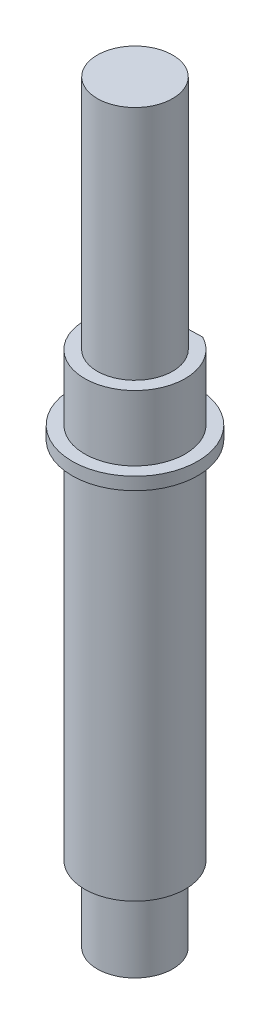
ISO-10303-21;
HEADER;
FILE_DESCRIPTION(('STEP AP214'),'2;1');
FILE_NAME('part.step','',(''),(''),'','','');
FILE_SCHEMA(('AUTOMOTIVE_DESIGN { 1 0 10303 214 1 1 1 1 }'));
ENDSEC;
DATA;
#1=APPLICATION_CONTEXT('core data for automotive mechanical design processes');
#2=APPLICATION_PROTOCOL_DEFINITION('international standard','automotive_design',2000,#1);
#3=PRODUCT_CONTEXT('',#1,'mechanical');
#4=PRODUCT('Part','Part','',(#3));
#5=PRODUCT_RELATED_PRODUCT_CATEGORY('part','',(#4));
#6=PRODUCT_DEFINITION_FORMATION('','',#4);
#7=PRODUCT_DEFINITION_CONTEXT('part definition',#1,'design');
#8=PRODUCT_DEFINITION('design','',#6,#7);
#9=PRODUCT_DEFINITION_SHAPE('','',#8);
#10=(LENGTH_UNIT() NAMED_UNIT(*) SI_UNIT(.MILLI.,.METRE.));
#11=(NAMED_UNIT(*) PLANE_ANGLE_UNIT() SI_UNIT($,.RADIAN.));
#12=(NAMED_UNIT(*) SI_UNIT($,.STERADIAN.) SOLID_ANGLE_UNIT());
#13=UNCERTAINTY_MEASURE_WITH_UNIT(LENGTH_MEASURE(1.E-05),#10,'distance_accuracy_value','');
#14=(GEOMETRIC_REPRESENTATION_CONTEXT(3) GLOBAL_UNCERTAINTY_ASSIGNED_CONTEXT((#13)) GLOBAL_UNIT_ASSIGNED_CONTEXT((#10,
#11,#12)) REPRESENTATION_CONTEXT('',''));
#15=CARTESIAN_POINT('',(0.,0.,0.));
#16=DIRECTION('',(0.,0.,1.));
#17=DIRECTION('',(1.,0.,0.));
#18=AXIS2_PLACEMENT_3D('',#15,#16,#17);
#19=CARTESIAN_POINT('',(0.,3.,0.));
#20=DIRECTION('',(0.,1.,0.));
#21=DIRECTION('',(0.,0.,1.));
#22=AXIS2_PLACEMENT_3D('',#19,#20,#21);
#23=CYLINDRICAL_SURFACE('',#22,2.);
#24=CARTESIAN_POINT('',(0.,3.,0.));
#25=DIRECTION('',(0.,-1.,0.));
#26=DIRECTION('',(0.,0.,-1.));
#27=AXIS2_PLACEMENT_3D('',#24,#25,#26);
#28=CIRCLE('',#27,2.);
#29=CARTESIAN_POINT('',(0.,3.,-2.));
#30=VERTEX_POINT('',#29);
#31=EDGE_CURVE('E90',#30,#30,#28,.T.);
#32=ORIENTED_EDGE('',*,*,#31,.F.);
#33=EDGE_LOOP('',(#32));
#34=FACE_BOUND('',#33,.T.);
#35=CARTESIAN_POINT('',(0.,17.5,0.));
#36=DIRECTION('',(0.,1.,0.));
#37=DIRECTION('',(0.,0.,1.));
#38=AXIS2_PLACEMENT_3D('',#35,#36,#37);
#39=CIRCLE('',#38,2.);
#40=CARTESIAN_POINT('',(0.,17.5,2.));
#41=VERTEX_POINT('',#40);
#42=EDGE_CURVE('E11',#41,#41,#39,.T.);
#43=ORIENTED_EDGE('',*,*,#42,.F.);
#44=EDGE_LOOP('',(#43));
#45=FACE_BOUND('',#44,.T.);
#46=ADVANCED_FACE('F35',(#34,#45),#23,.T.);
#47=CARTESIAN_POINT('',(0.,30.,0.));
#48=DIRECTION('',(0.,-1.,0.));
#49=DIRECTION('',(0.,0.,-1.));
#50=AXIS2_PLACEMENT_3D('',#47,#48,#49);
#51=CYLINDRICAL_SURFACE('',#50,1.5);
#52=CARTESIAN_POINT('',(0.,3.,0.));
#53=DIRECTION('',(0.,-1.,0.));
#54=DIRECTION('',(0.,0.,-1.));
#55=AXIS2_PLACEMENT_3D('',#52,#53,#54);
#56=CIRCLE('',#55,1.5);
#57=CARTESIAN_POINT('',(0.,3.,-1.5));
#58=VERTEX_POINT('',#57);
#59=EDGE_CURVE('E74',#58,#58,#56,.T.);
#60=ORIENTED_EDGE('',*,*,#59,.T.);
#61=EDGE_LOOP('',(#60));
#62=FACE_BOUND('',#61,.T.);
#63=CARTESIAN_POINT('',(0.,0.,0.));
#64=DIRECTION('',(0.,1.,0.));
#65=DIRECTION('',(0.,0.,1.));
#66=AXIS2_PLACEMENT_3D('',#63,#64,#65);
#67=CIRCLE('',#66,1.5);
#68=CARTESIAN_POINT('',(0.,0.,1.5));
#69=VERTEX_POINT('',#68);
#70=EDGE_CURVE('E93',#69,#69,#67,.T.);
#71=ORIENTED_EDGE('',*,*,#70,.T.);
#72=EDGE_LOOP('',(#71));
#73=FACE_BOUND('',#72,.T.);
#74=ADVANCED_FACE('F37',(#62,#73),#51,.T.);
#75=CARTESIAN_POINT('',(0.,0.,0.));
#76=DIRECTION('',(0.,1.,0.));
#77=DIRECTION('',(0.,0.,1.));
#78=AXIS2_PLACEMENT_3D('',#75,#76,#77);
#79=PLANE('',#78);
#80=ORIENTED_EDGE('',*,*,#70,.F.);
#81=EDGE_LOOP('',(#80));
#82=FACE_BOUND('',#81,.T.);
#83=ADVANCED_FACE('F99',(#82),#79,.F.);
#84=CARTESIAN_POINT('',(0.,3.,0.));
#85=DIRECTION('',(0.,-1.,0.));
#86=DIRECTION('',(0.,0.,-1.));
#87=AXIS2_PLACEMENT_3D('',#84,#85,#86);
#88=PLANE('',#87);
#89=ORIENTED_EDGE('',*,*,#31,.T.);
#90=EDGE_LOOP('',(#89));
#91=FACE_BOUND('',#90,.T.);
#92=ORIENTED_EDGE('',*,*,#59,.F.);
#93=EDGE_LOOP('',(#92));
#94=FACE_BOUND('',#93,.T.);
#95=ADVANCED_FACE('F101',(#91,#94),#88,.T.);
#96=CARTESIAN_POINT('',(0.,17.5,0.));
#97=DIRECTION('',(0.,1.,0.));
#98=DIRECTION('',(0.,0.,1.));
#99=AXIS2_PLACEMENT_3D('',#96,#97,#98);
#100=CYLINDRICAL_SURFACE('',#99,2.5);
#101=CARTESIAN_POINT('',(0.,17.5,0.));
#102=DIRECTION('',(0.,1.,0.));
#103=DIRECTION('',(0.,0.,1.));
#104=AXIS2_PLACEMENT_3D('',#101,#102,#103);
#105=CIRCLE('',#104,2.5);
#106=CARTESIAN_POINT('',(0.,17.5,2.5));
#107=VERTEX_POINT('',#106);
#108=EDGE_CURVE('E83',#107,#107,#105,.T.);
#109=ORIENTED_EDGE('',*,*,#108,.T.);
#110=EDGE_LOOP('',(#109));
#111=FACE_BOUND('',#110,.T.);
#112=CARTESIAN_POINT('',(0.,18.,0.));
#113=DIRECTION('',(0.,1.,0.));
#114=DIRECTION('',(0.,0.,1.));
#115=AXIS2_PLACEMENT_3D('',#112,#113,#114);
#116=CIRCLE('',#115,2.5);
#117=CARTESIAN_POINT('',(0.,18.,2.5));
#118=VERTEX_POINT('',#117);
#119=EDGE_CURVE('E69',#118,#118,#116,.T.);
#120=ORIENTED_EDGE('',*,*,#119,.F.);
#121=EDGE_LOOP('',(#120));
#122=FACE_BOUND('',#121,.T.);
#123=ADVANCED_FACE('F106',(#111,#122),#100,.T.);
#124=CARTESIAN_POINT('',(0.,17.5,0.));
#125=DIRECTION('',(0.,1.,0.));
#126=DIRECTION('',(0.,0.,1.));
#127=AXIS2_PLACEMENT_3D('',#124,#125,#126);
#128=PLANE('',#127);
#129=ORIENTED_EDGE('',*,*,#42,.T.);
#130=EDGE_LOOP('',(#129));
#131=FACE_BOUND('',#130,.T.);
#132=ORIENTED_EDGE('',*,*,#108,.F.);
#133=EDGE_LOOP('',(#132));
#134=FACE_BOUND('',#133,.T.);
#135=ADVANCED_FACE('F134',(#131,#134),#128,.F.);
#136=CARTESIAN_POINT('',(0.,30.,0.));
#137=DIRECTION('',(0.,1.,0.));
#138=DIRECTION('',(0.,0.,1.));
#139=AXIS2_PLACEMENT_3D('',#136,#137,#138);
#140=PLANE('',#139);
#141=CARTESIAN_POINT('',(0.,30.,0.));
#142=DIRECTION('',(0.,1.,0.));
#143=DIRECTION('',(0.,0.,1.));
#144=AXIS2_PLACEMENT_3D('',#141,#142,#143);
#145=CIRCLE('',#144,1.5);
#146=CARTESIAN_POINT('',(0.,30.,1.5));
#147=VERTEX_POINT('',#146);
#148=EDGE_CURVE('E44',#147,#147,#145,.T.);
#149=ORIENTED_EDGE('',*,*,#148,.T.);
#150=EDGE_LOOP('',(#149));
#151=FACE_BOUND('',#150,.T.);
#152=ADVANCED_FACE('F137',(#151),#140,.T.);
#153=CARTESIAN_POINT('',(0.,20.6,0.));
#154=DIRECTION('',(0.,1.,0.));
#155=DIRECTION('',(0.,0.,1.));
#156=AXIS2_PLACEMENT_3D('',#153,#154,#155);
#157=CIRCLE('',#156,1.5);
#158=CARTESIAN_POINT('',(0.,20.6,1.5));
#159=VERTEX_POINT('',#158);
#160=EDGE_CURVE('E79',#159,#159,#157,.T.);
#161=ORIENTED_EDGE('',*,*,#160,.T.);
#162=EDGE_LOOP('',(#161));
#163=FACE_BOUND('',#162,.T.);
#164=ORIENTED_EDGE('',*,*,#148,.F.);
#165=EDGE_LOOP('',(#164));
#166=FACE_BOUND('',#165,.T.);
#167=ADVANCED_FACE('F110',(#163,#166),#51,.T.);
#168=CARTESIAN_POINT('',(0.,20.6,0.));
#169=DIRECTION('',(0.,1.,0.));
#170=DIRECTION('',(0.,0.,1.));
#171=AXIS2_PLACEMENT_3D('',#168,#169,#170);
#172=PLANE('',#171);
#173=CARTESIAN_POINT('',(0.,20.6,0.));
#174=DIRECTION('',(0.,1.,0.));
#175=DIRECTION('',(0.,0.,1.));
#176=AXIS2_PLACEMENT_3D('',#173,#174,#175);
#177=CIRCLE('',#176,2.);
#178=CARTESIAN_POINT('',(-1.02224970081514,20.6,-1.71901295782881));
#179=VERTEX_POINT('',#178);
#180=CARTESIAN_POINT('',(0.916253010313562,20.6,-1.77777400731683));
#181=VERTEX_POINT('',#180);
#182=EDGE_CURVE('E78',#179,#181,#177,.T.);
#183=ORIENTED_EDGE('',*,*,#182,.T.);
#184=DIRECTION('',(-0.99954088962964,0.,0.0302986791525441));
#185=VECTOR('',#184,1.);
#186=CARTESIAN_POINT('',(0.916253010313562,20.6,-1.77777400731683));
#187=LINE('',#186,#185);
#188=EDGE_CURVE('E50',#181,#179,#187,.T.);
#189=ORIENTED_EDGE('',*,*,#188,.T.);
#190=EDGE_LOOP('',(#183,#189));
#191=FACE_BOUND('',#190,.T.);
#192=ORIENTED_EDGE('',*,*,#160,.F.);
#193=EDGE_LOOP('',(#192));
#194=FACE_BOUND('',#193,.T.);
#195=ADVANCED_FACE('F128',(#191,#194),#172,.T.);
#196=CARTESIAN_POINT('',(0.,18.,0.));
#197=DIRECTION('',(0.,-1.,0.));
#198=DIRECTION('',(0.,0.,-1.));
#199=AXIS2_PLACEMENT_3D('',#196,#197,#198);
#200=PLANE('',#199);
#201=DIRECTION('',(-0.99954088962964,0.,0.0302986791525441));
#202=VECTOR('',#201,1.);
#203=CARTESIAN_POINT('',(0.916253010313562,18.,-1.77777400731683));
#204=LINE('',#203,#202);
#205=CARTESIAN_POINT('',(0.916253010313562,18.,-1.77777400731683));
#206=VERTEX_POINT('',#205);
#207=CARTESIAN_POINT('',(-1.02224970081514,18.,-1.71901295782881));
#208=VERTEX_POINT('',#207);
#209=EDGE_CURVE('E73',#206,#208,#204,.T.);
#210=ORIENTED_EDGE('',*,*,#209,.F.);
#211=CARTESIAN_POINT('',(0.,18.,0.));
#212=DIRECTION('',(0.,1.,0.));
#213=DIRECTION('',(0.,0.,1.));
#214=AXIS2_PLACEMENT_3D('',#211,#212,#213);
#215=CIRCLE('',#214,2.);
#216=EDGE_CURVE('E59',#208,#206,#215,.T.);
#217=ORIENTED_EDGE('',*,*,#216,.F.);
#218=EDGE_LOOP('',(#210,#217));
#219=FACE_BOUND('',#218,.T.);
#220=ORIENTED_EDGE('',*,*,#119,.T.);
#221=EDGE_LOOP('',(#220));
#222=FACE_BOUND('',#221,.T.);
#223=ADVANCED_FACE('F76',(#219,#222),#200,.F.);
#224=CARTESIAN_POINT('',(0.916253010313562,20.6,-1.77777400731683));
#225=DIRECTION('',(0.0302986791525441,0.,0.99954088962964));
#226=DIRECTION('',(0.99954088962964,0.,-0.0302986791525441));
#227=AXIS2_PLACEMENT_3D('',#224,#225,#226);
#228=PLANE('',#227);
#229=ORIENTED_EDGE('',*,*,#209,.T.);
#230=DIRECTION('',(0.,-1.,0.));
#231=VECTOR('',#230,1.);
#232=CARTESIAN_POINT('',(-1.02224970081514,20.6,-1.71901295782881));
#233=LINE('',#232,#231);
#234=EDGE_CURVE('E67',#179,#208,#233,.T.);
#235=ORIENTED_EDGE('',*,*,#234,.F.);
#236=ORIENTED_EDGE('',*,*,#188,.F.);
#237=DIRECTION('',(0.,-1.,0.));
#238=VECTOR('',#237,1.);
#239=CARTESIAN_POINT('',(0.916253010313562,20.6,-1.77777400731683));
#240=LINE('',#239,#238);
#241=EDGE_CURVE('E66',#181,#206,#240,.T.);
#242=ORIENTED_EDGE('',*,*,#241,.T.);
#243=EDGE_LOOP('',(#229,#235,#236,#242));
#244=FACE_BOUND('',#243,.T.);
#245=ADVANCED_FACE('F72',(#244),#228,.F.);
#246=ORIENTED_EDGE('',*,*,#234,.T.);
#247=ORIENTED_EDGE('',*,*,#216,.T.);
#248=ORIENTED_EDGE('',*,*,#241,.F.);
#249=ORIENTED_EDGE('',*,*,#182,.F.);
#250=EDGE_LOOP('',(#246,#247,#248,#249));
#251=FACE_BOUND('',#250,.T.);
#252=ADVANCED_FACE('F64',(#251),#23,.T.);
#253=CLOSED_SHELL('',(#46,#74,#83,#95,#123,#135,#152,#167,#195,#223,#245,#252));
#254=MANIFOLD_SOLID_BREP('B2',#253);
#255=ADVANCED_BREP_SHAPE_REPRESENTATION('',(#18,#254),#14);
#256=SHAPE_DEFINITION_REPRESENTATION(#9,#255);
ENDSEC;
END-ISO-10303-21;
